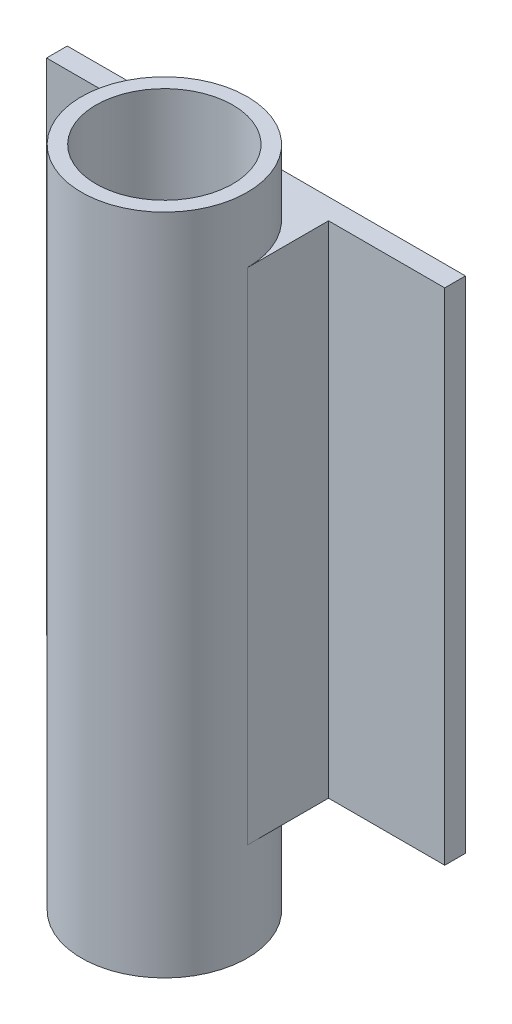
ISO-10303-21;
HEADER;
FILE_DESCRIPTION(('STEP AP214'),'2;1');
FILE_NAME('part.step','',(''),(''),'','','');
FILE_SCHEMA(('AUTOMOTIVE_DESIGN { 1 0 10303 214 1 1 1 1 }'));
ENDSEC;
DATA;
#1=APPLICATION_CONTEXT('core data for automotive mechanical design processes');
#2=APPLICATION_PROTOCOL_DEFINITION('international standard','automotive_design',2000,#1);
#3=PRODUCT_CONTEXT('',#1,'mechanical');
#4=PRODUCT('Part','Part','',(#3));
#5=PRODUCT_RELATED_PRODUCT_CATEGORY('part','',(#4));
#6=PRODUCT_DEFINITION_FORMATION('','',#4);
#7=PRODUCT_DEFINITION_CONTEXT('part definition',#1,'design');
#8=PRODUCT_DEFINITION('design','',#6,#7);
#9=PRODUCT_DEFINITION_SHAPE('','',#8);
#10=(LENGTH_UNIT() NAMED_UNIT(*) SI_UNIT(.MILLI.,.METRE.));
#11=(NAMED_UNIT(*) PLANE_ANGLE_UNIT() SI_UNIT($,.RADIAN.));
#12=(NAMED_UNIT(*) SI_UNIT($,.STERADIAN.) SOLID_ANGLE_UNIT());
#13=UNCERTAINTY_MEASURE_WITH_UNIT(LENGTH_MEASURE(1.E-05),#10,'distance_accuracy_value','');
#14=(GEOMETRIC_REPRESENTATION_CONTEXT(3) GLOBAL_UNCERTAINTY_ASSIGNED_CONTEXT((#13)) GLOBAL_UNIT_ASSIGNED_CONTEXT((#10,
#11,#12)) REPRESENTATION_CONTEXT('',''));
#15=CARTESIAN_POINT('',(0.,0.,0.));
#16=DIRECTION('',(0.,0.,1.));
#17=DIRECTION('',(1.,0.,0.));
#18=AXIS2_PLACEMENT_3D('',#15,#16,#17);
#19=CARTESIAN_POINT('',(-20.955,3.11393374928046E-11,0.));
#20=DIRECTION('',(0.,1.,0.));
#21=DIRECTION('',(0.,0.,1.));
#22=AXIS2_PLACEMENT_3D('',#19,#20,#21);
#23=PLANE('',#22);
#24=CARTESIAN_POINT('',(0.,3.11406296372367E-11,0.));
#25=DIRECTION('',(0.,-1.,0.));
#26=DIRECTION('',(0.,0.,-1.));
#27=AXIS2_PLACEMENT_3D('',#24,#25,#26);
#28=CIRCLE('',#27,20.955);
#29=CARTESIAN_POINT('',(0.,3.11406296372367E-11,-20.955));
#30=VERTEX_POINT('',#29);
#31=EDGE_CURVE('E162',#30,#30,#28,.T.);
#32=ORIENTED_EDGE('',*,*,#31,.F.);
#33=EDGE_LOOP('',(#32));
#34=FACE_BOUND('',#33,.T.);
#35=CARTESIAN_POINT('',(0.,3.11380453483725E-11,0.));
#36=DIRECTION('',(0.,-1.,0.));
#37=DIRECTION('',(0.,0.,-1.));
#38=AXIS2_PLACEMENT_3D('',#35,#36,#37);
#39=CIRCLE('',#38,25.3999999937946);
#40=CARTESIAN_POINT('',(0.,3.11380453483725E-11,-25.3999999937946));
#41=VERTEX_POINT('',#40);
#42=EDGE_CURVE('E11',#41,#41,#39,.T.);
#43=ORIENTED_EDGE('',*,*,#42,.T.);
#44=EDGE_LOOP('',(#43));
#45=FACE_BOUND('',#44,.T.);
#46=ADVANCED_FACE('F41',(#34,#45),#23,.F.);
#47=CARTESIAN_POINT('',(0.,0.,0.));
#48=DIRECTION('',(0.,-1.,0.));
#49=DIRECTION('',(0.,0.,-1.));
#50=AXIS2_PLACEMENT_3D('',#47,#48,#49);
#51=CYLINDRICAL_SURFACE('',#50,25.3999999938142);
#52=CARTESIAN_POINT('',(0.,183.199999999963,0.));
#53=DIRECTION('',(0.,1.,0.));
#54=DIRECTION('',(0.,0.,1.));
#55=AXIS2_PLACEMENT_3D('',#52,#53,#54);
#56=CIRCLE('',#55,25.3999999937946);
#57=CARTESIAN_POINT('',(-25.3999999937946,183.199999999963,0.));
#58=VERTEX_POINT('',#57);
#59=CARTESIAN_POINT('',(25.3999999938044,183.199999999963,0.));
#60=VERTEX_POINT('',#59);
#61=EDGE_CURVE('E55',#58,#60,#56,.F.);
#62=ORIENTED_EDGE('',*,*,#61,.F.);
#63=DIRECTION('',(0.,-1.,0.));
#64=VECTOR('',#63,1.);
#65=CARTESIAN_POINT('',(-25.3999999937946,309.138725178568,0.));
#66=LINE('',#65,#64);
#67=CARTESIAN_POINT('',(-25.3999999938142,30.0000000000311,0.));
#68=VERTEX_POINT('',#67);
#69=EDGE_CURVE('E60',#58,#68,#66,.T.);
#70=ORIENTED_EDGE('',*,*,#69,.T.);
#71=CARTESIAN_POINT('',(0.,30.0000000000311,0.));
#72=DIRECTION('',(0.,-1.,0.));
#73=DIRECTION('',(0.,0.,-1.));
#74=AXIS2_PLACEMENT_3D('',#71,#72,#73);
#75=CIRCLE('',#74,25.3999999937946);
#76=CARTESIAN_POINT('',(25.3999999937946,30.0000000000311,0.));
#77=VERTEX_POINT('',#76);
#78=EDGE_CURVE('E132',#68,#77,#75,.T.);
#79=ORIENTED_EDGE('',*,*,#78,.T.);
#80=DIRECTION('',(0.,-1.,0.));
#81=VECTOR('',#80,1.);
#82=CARTESIAN_POINT('',(25.3999999937946,309.138725178568,0.));
#83=LINE('',#82,#81);
#84=EDGE_CURVE('E149',#60,#77,#83,.T.);
#85=ORIENTED_EDGE('',*,*,#84,.F.);
#86=EDGE_LOOP('',(#62,#70,#79,#85));
#87=FACE_BOUND('',#86,.T.);
#88=ORIENTED_EDGE('',*,*,#42,.F.);
#89=EDGE_LOOP('',(#88));
#90=FACE_BOUND('',#89,.T.);
#91=CARTESIAN_POINT('',(0.,203.199999999963,0.));
#92=DIRECTION('',(0.,-1.,0.));
#93=DIRECTION('',(0.,0.,-1.));
#94=AXIS2_PLACEMENT_3D('',#91,#92,#93);
#95=CIRCLE('',#94,25.3999999938337);
#96=CARTESIAN_POINT('',(0.,203.199999999963,-25.3999999938337));
#97=VERTEX_POINT('',#96);
#98=EDGE_CURVE('E48',#97,#97,#95,.T.);
#99=ORIENTED_EDGE('',*,*,#98,.T.);
#100=EDGE_LOOP('',(#99));
#101=FACE_BOUND('',#100,.T.);
#102=ADVANCED_FACE('F182',(#87,#90,#101),#51,.T.);
#103=CARTESIAN_POINT('',(-20.9550000000491,203.199999999963,0.));
#104=DIRECTION('',(0.,-1.,0.));
#105=DIRECTION('',(0.,0.,-1.));
#106=AXIS2_PLACEMENT_3D('',#103,#104,#105);
#107=PLANE('',#106);
#108=ORIENTED_EDGE('',*,*,#98,.F.);
#109=EDGE_LOOP('',(#108));
#110=FACE_BOUND('',#109,.T.);
#111=CARTESIAN_POINT('',(0.,203.199999999963,0.));
#112=DIRECTION('',(0.,-1.,0.));
#113=DIRECTION('',(0.,0.,-1.));
#114=AXIS2_PLACEMENT_3D('',#111,#112,#113);
#115=CIRCLE('',#114,20.9550000000491);
#116=CARTESIAN_POINT('',(0.,203.199999999963,-20.9550000000491));
#117=VERTEX_POINT('',#116);
#118=EDGE_CURVE('E177',#117,#117,#115,.T.);
#119=ORIENTED_EDGE('',*,*,#118,.T.);
#120=EDGE_LOOP('',(#119));
#121=FACE_BOUND('',#120,.T.);
#122=ADVANCED_FACE('F184',(#110,#121),#107,.F.);
#123=CARTESIAN_POINT('',(0.,0.,0.));
#124=DIRECTION('',(0.,-1.,0.));
#125=DIRECTION('',(0.,0.,-1.));
#126=AXIS2_PLACEMENT_3D('',#123,#124,#125);
#127=CYLINDRICAL_SURFACE('',#126,20.9550000000491);
#128=ORIENTED_EDGE('',*,*,#118,.F.);
#129=EDGE_LOOP('',(#128));
#130=FACE_BOUND('',#129,.T.);
#131=CARTESIAN_POINT('',(0.,165.099999999963,0.));
#132=DIRECTION('',(0.,-1.,0.));
#133=DIRECTION('',(0.,0.,-1.));
#134=AXIS2_PLACEMENT_3D('',#131,#132,#133);
#135=CIRCLE('',#134,20.9550000000491);
#136=CARTESIAN_POINT('',(0.,165.099999999963,-20.9550000000491));
#137=VERTEX_POINT('',#136);
#138=EDGE_CURVE('E174',#137,#137,#135,.T.);
#139=ORIENTED_EDGE('',*,*,#138,.T.);
#140=EDGE_LOOP('',(#139));
#141=FACE_BOUND('',#140,.T.);
#142=ADVANCED_FACE('F187',(#130,#141),#127,.F.);
#143=CARTESIAN_POINT('',(-19.177000000049,165.099999999963,0.));
#144=DIRECTION('',(0.,-1.,0.));
#145=DIRECTION('',(0.,0.,-1.));
#146=AXIS2_PLACEMENT_3D('',#143,#144,#145);
#147=PLANE('',#146);
#148=ORIENTED_EDGE('',*,*,#138,.F.);
#149=EDGE_LOOP('',(#148));
#150=FACE_BOUND('',#149,.T.);
#151=CARTESIAN_POINT('',(0.,165.099999999963,0.));
#152=DIRECTION('',(0.,-1.,0.));
#153=DIRECTION('',(0.,0.,-1.));
#154=AXIS2_PLACEMENT_3D('',#151,#152,#153);
#155=CIRCLE('',#154,19.177000000049);
#156=CARTESIAN_POINT('',(0.,165.099999999963,-19.177000000049));
#157=VERTEX_POINT('',#156);
#158=EDGE_CURVE('E171',#157,#157,#155,.T.);
#159=ORIENTED_EDGE('',*,*,#158,.T.);
#160=EDGE_LOOP('',(#159));
#161=FACE_BOUND('',#160,.T.);
#162=ADVANCED_FACE('F193',(#150,#161),#147,.F.);
#163=CARTESIAN_POINT('',(0.,0.,0.));
#164=DIRECTION('',(0.,-1.,0.));
#165=DIRECTION('',(0.,0.,-1.));
#166=AXIS2_PLACEMENT_3D('',#163,#164,#165);
#167=CYLINDRICAL_SURFACE('',#166,19.177000000049);
#168=ORIENTED_EDGE('',*,*,#158,.F.);
#169=EDGE_LOOP('',(#168));
#170=FACE_BOUND('',#169,.T.);
#171=CARTESIAN_POINT('',(0.,38.0999999999633,0.));
#172=DIRECTION('',(0.,-1.,0.));
#173=DIRECTION('',(0.,0.,-1.));
#174=AXIS2_PLACEMENT_3D('',#171,#172,#173);
#175=CIRCLE('',#174,19.177000000049);
#176=CARTESIAN_POINT('',(0.,38.0999999999633,-19.177000000049));
#177=VERTEX_POINT('',#176);
#178=EDGE_CURVE('E168',#177,#177,#175,.T.);
#179=ORIENTED_EDGE('',*,*,#178,.T.);
#180=EDGE_LOOP('',(#179));
#181=FACE_BOUND('',#180,.T.);
#182=ADVANCED_FACE('F199',(#170,#181),#167,.F.);
#183=CARTESIAN_POINT('',(-20.955,38.0999999999972,0.));
#184=DIRECTION('',(0.,1.,0.));
#185=DIRECTION('',(0.,0.,1.));
#186=AXIS2_PLACEMENT_3D('',#183,#184,#185);
#187=PLANE('',#186);
#188=ORIENTED_EDGE('',*,*,#178,.F.);
#189=EDGE_LOOP('',(#188));
#190=FACE_BOUND('',#189,.T.);
#191=CARTESIAN_POINT('',(0.,38.1000000000311,0.));
#192=DIRECTION('',(0.,-1.,0.));
#193=DIRECTION('',(0.,0.,-1.));
#194=AXIS2_PLACEMENT_3D('',#191,#192,#193);
#195=CIRCLE('',#194,20.955);
#196=CARTESIAN_POINT('',(0.,38.1000000000311,-20.955));
#197=VERTEX_POINT('',#196);
#198=EDGE_CURVE('E165',#197,#197,#195,.T.);
#199=ORIENTED_EDGE('',*,*,#198,.T.);
#200=EDGE_LOOP('',(#199));
#201=FACE_BOUND('',#200,.T.);
#202=ADVANCED_FACE('F205',(#190,#201),#187,.F.);
#203=CARTESIAN_POINT('',(0.,0.,0.));
#204=DIRECTION('',(0.,-1.,0.));
#205=DIRECTION('',(0.,0.,-1.));
#206=AXIS2_PLACEMENT_3D('',#203,#204,#205);
#207=CYLINDRICAL_SURFACE('',#206,20.955);
#208=ORIENTED_EDGE('',*,*,#198,.F.);
#209=EDGE_LOOP('',(#208));
#210=FACE_BOUND('',#209,.T.);
#211=ORIENTED_EDGE('',*,*,#31,.T.);
#212=EDGE_LOOP('',(#211));
#213=FACE_BOUND('',#212,.T.);
#214=ADVANCED_FACE('F211',(#210,#213),#207,.F.);
#215=CARTESIAN_POINT('',(0.,183.199999999963,0.));
#216=DIRECTION('',(0.,1.,0.));
#217=DIRECTION('',(0.,0.,1.));
#218=AXIS2_PLACEMENT_3D('',#215,#216,#217);
#219=PLANE('',#218);
#220=DIRECTION('',(0.,0.,-1.));
#221=VECTOR('',#220,1.);
#222=CARTESIAN_POINT('',(-25.3999999937946,183.199999999963,0.));
#223=LINE('',#222,#221);
#224=CARTESIAN_POINT('',(-25.3999999937946,183.199999999963,-24.8999999937946));
#225=VERTEX_POINT('',#224);
#226=EDGE_CURVE('E107',#58,#225,#223,.T.);
#227=ORIENTED_EDGE('',*,*,#226,.F.);
#228=ORIENTED_EDGE('',*,*,#61,.T.);
#229=DIRECTION('',(0.,0.,-1.));
#230=VECTOR('',#229,1.);
#231=CARTESIAN_POINT('',(25.3999999937946,183.199999999963,0.));
#232=LINE('',#231,#230);
#233=CARTESIAN_POINT('',(25.3999999937946,183.199999999963,-24.8999999937946));
#234=VERTEX_POINT('',#233);
#235=EDGE_CURVE('E135',#60,#234,#232,.T.);
#236=ORIENTED_EDGE('',*,*,#235,.T.);
#237=DIRECTION('',(1.,0.,0.));
#238=VECTOR('',#237,1.);
#239=CARTESIAN_POINT('',(0.,183.199999999963,-24.8999999937946));
#240=LINE('',#239,#238);
#241=CARTESIAN_POINT('',(61.,183.199999999963,-24.8999999937946));
#242=VERTEX_POINT('',#241);
#243=EDGE_CURVE('E137',#234,#242,#240,.T.);
#244=ORIENTED_EDGE('',*,*,#243,.T.);
#245=DIRECTION('',(0.,0.,1.));
#246=VECTOR('',#245,1.);
#247=CARTESIAN_POINT('',(61.,183.199999999963,0.));
#248=LINE('',#247,#246);
#249=CARTESIAN_POINT('',(61.,183.199999999963,-31.2499999937946));
#250=VERTEX_POINT('',#249);
#251=EDGE_CURVE('E139',#250,#242,#248,.T.);
#252=ORIENTED_EDGE('',*,*,#251,.F.);
#253=DIRECTION('',(1.,0.,0.));
#254=VECTOR('',#253,1.);
#255=CARTESIAN_POINT('',(0.,183.199999999963,-31.2499999937946));
#256=LINE('',#255,#254);
#257=CARTESIAN_POINT('',(-61.,183.199999999963,-31.2499999937946));
#258=VERTEX_POINT('',#257);
#259=EDGE_CURVE('E144',#258,#250,#256,.T.);
#260=ORIENTED_EDGE('',*,*,#259,.F.);
#261=DIRECTION('',(0.,0.,1.));
#262=VECTOR('',#261,1.);
#263=CARTESIAN_POINT('',(-61.,183.199999999963,0.));
#264=LINE('',#263,#262);
#265=CARTESIAN_POINT('',(-61.,183.199999999963,-24.8999999937946));
#266=VERTEX_POINT('',#265);
#267=EDGE_CURVE('E109',#258,#266,#264,.T.);
#268=ORIENTED_EDGE('',*,*,#267,.T.);
#269=DIRECTION('',(1.,0.,0.));
#270=VECTOR('',#269,1.);
#271=CARTESIAN_POINT('',(0.,183.199999999963,-24.8999999937946));
#272=LINE('',#271,#270);
#273=EDGE_CURVE('E103',#266,#225,#272,.T.);
#274=ORIENTED_EDGE('',*,*,#273,.T.);
#275=EDGE_LOOP('',(#227,#228,#236,#244,#252,#260,#268,#274));
#276=FACE_BOUND('',#275,.T.);
#277=ADVANCED_FACE('F105',(#276),#219,.T.);
#278=CARTESIAN_POINT('',(0.,30.0000000000311,0.));
#279=DIRECTION('',(0.,-1.,0.));
#280=DIRECTION('',(0.,0.,-1.));
#281=AXIS2_PLACEMENT_3D('',#278,#279,#280);
#282=PLANE('',#281);
#283=ORIENTED_EDGE('',*,*,#78,.F.);
#284=DIRECTION('',(0.,0.,-1.));
#285=VECTOR('',#284,1.);
#286=CARTESIAN_POINT('',(-25.3999999937946,30.0000000000311,0.));
#287=LINE('',#286,#285);
#288=CARTESIAN_POINT('',(-25.3999999937946,30.0000000000311,-24.8999999937946));
#289=VERTEX_POINT('',#288);
#290=EDGE_CURVE('E112',#68,#289,#287,.T.);
#291=ORIENTED_EDGE('',*,*,#290,.T.);
#292=DIRECTION('',(1.,0.,0.));
#293=VECTOR('',#292,1.);
#294=CARTESIAN_POINT('',(0.,30.0000000000311,-24.8999999937946));
#295=LINE('',#294,#293);
#296=CARTESIAN_POINT('',(-61.,30.0000000000311,-24.8999999937946));
#297=VERTEX_POINT('',#296);
#298=EDGE_CURVE('E118',#297,#289,#295,.T.);
#299=ORIENTED_EDGE('',*,*,#298,.F.);
#300=DIRECTION('',(0.,0.,1.));
#301=VECTOR('',#300,1.);
#302=CARTESIAN_POINT('',(-61.,30.0000000000311,0.));
#303=LINE('',#302,#301);
#304=CARTESIAN_POINT('',(-61.,30.0000000000311,-31.2499999937946));
#305=VERTEX_POINT('',#304);
#306=EDGE_CURVE('E147',#305,#297,#303,.T.);
#307=ORIENTED_EDGE('',*,*,#306,.F.);
#308=DIRECTION('',(1.,0.,0.));
#309=VECTOR('',#308,1.);
#310=CARTESIAN_POINT('',(0.,30.0000000000311,-31.2499999937946));
#311=LINE('',#310,#309);
#312=CARTESIAN_POINT('',(61.,30.0000000000311,-31.2499999937946));
#313=VERTEX_POINT('',#312);
#314=EDGE_CURVE('E128',#305,#313,#311,.T.);
#315=ORIENTED_EDGE('',*,*,#314,.T.);
#316=DIRECTION('',(0.,0.,1.));
#317=VECTOR('',#316,1.);
#318=CARTESIAN_POINT('',(61.,30.0000000000311,0.));
#319=LINE('',#318,#317);
#320=CARTESIAN_POINT('',(61.,30.0000000000311,-24.8999999937946));
#321=VERTEX_POINT('',#320);
#322=EDGE_CURVE('E125',#313,#321,#319,.T.);
#323=ORIENTED_EDGE('',*,*,#322,.T.);
#324=CARTESIAN_POINT('',(25.3999999937946,30.0000000000311,-24.8999999937946));
#325=VERTEX_POINT('',#324);
#326=EDGE_CURVE('E153',#325,#321,#295,.T.);
#327=ORIENTED_EDGE('',*,*,#326,.F.);
#328=DIRECTION('',(0.,0.,-1.));
#329=VECTOR('',#328,1.);
#330=CARTESIAN_POINT('',(25.3999999937946,30.0000000000311,0.));
#331=LINE('',#330,#329);
#332=EDGE_CURVE('E152',#77,#325,#331,.T.);
#333=ORIENTED_EDGE('',*,*,#332,.F.);
#334=EDGE_LOOP('',(#283,#291,#299,#307,#315,#323,#327,#333));
#335=FACE_BOUND('',#334,.T.);
#336=ADVANCED_FACE('F230',(#335),#282,.T.);
#337=CARTESIAN_POINT('',(-25.3999999937946,309.138725178568,0.));
#338=DIRECTION('',(-1.,0.,0.));
#339=DIRECTION('',(0.,0.,1.));
#340=AXIS2_PLACEMENT_3D('',#337,#338,#339);
#341=PLANE('',#340);
#342=ORIENTED_EDGE('',*,*,#69,.F.);
#343=ORIENTED_EDGE('',*,*,#226,.T.);
#344=DIRECTION('',(0.,-1.,0.));
#345=VECTOR('',#344,1.);
#346=CARTESIAN_POINT('',(-25.3999999937946,309.138725178568,-24.8999999937946));
#347=LINE('',#346,#345);
#348=EDGE_CURVE('E115',#225,#289,#347,.T.);
#349=ORIENTED_EDGE('',*,*,#348,.T.);
#350=ORIENTED_EDGE('',*,*,#290,.F.);
#351=EDGE_LOOP('',(#342,#343,#349,#350));
#352=FACE_BOUND('',#351,.T.);
#353=ADVANCED_FACE('F124',(#352),#341,.T.);
#354=CARTESIAN_POINT('',(0.,309.138725178568,-24.8999999937946));
#355=DIRECTION('',(0.,0.,-1.));
#356=DIRECTION('',(-1.,0.,0.));
#357=AXIS2_PLACEMENT_3D('',#354,#355,#356);
#358=PLANE('',#357);
#359=ORIENTED_EDGE('',*,*,#273,.F.);
#360=DIRECTION('',(0.,-1.,0.));
#361=VECTOR('',#360,1.);
#362=CARTESIAN_POINT('',(-61.,309.138725178568,-24.8999999937946));
#363=LINE('',#362,#361);
#364=EDGE_CURVE('E122',#266,#297,#363,.T.);
#365=ORIENTED_EDGE('',*,*,#364,.T.);
#366=ORIENTED_EDGE('',*,*,#298,.T.);
#367=ORIENTED_EDGE('',*,*,#348,.F.);
#368=EDGE_LOOP('',(#359,#365,#366,#367));
#369=FACE_BOUND('',#368,.T.);
#370=ADVANCED_FACE('F116',(#369),#358,.F.);
#371=CARTESIAN_POINT('',(-61.,309.138725178568,0.));
#372=DIRECTION('',(1.,0.,0.));
#373=DIRECTION('',(0.,0.,-1.));
#374=AXIS2_PLACEMENT_3D('',#371,#372,#373);
#375=PLANE('',#374);
#376=ORIENTED_EDGE('',*,*,#267,.F.);
#377=DIRECTION('',(0.,-1.,0.));
#378=VECTOR('',#377,1.);
#379=CARTESIAN_POINT('',(-61.,309.138725178568,-31.2499999937946));
#380=LINE('',#379,#378);
#381=EDGE_CURVE('E158',#258,#305,#380,.T.);
#382=ORIENTED_EDGE('',*,*,#381,.T.);
#383=ORIENTED_EDGE('',*,*,#306,.T.);
#384=ORIENTED_EDGE('',*,*,#364,.F.);
#385=EDGE_LOOP('',(#376,#382,#383,#384));
#386=FACE_BOUND('',#385,.T.);
#387=ADVANCED_FACE('F233',(#386),#375,.F.);
#388=CARTESIAN_POINT('',(0.,309.138725178568,-31.2499999937946));
#389=DIRECTION('',(0.,0.,-1.));
#390=DIRECTION('',(-1.,0.,0.));
#391=AXIS2_PLACEMENT_3D('',#388,#389,#390);
#392=PLANE('',#391);
#393=ORIENTED_EDGE('',*,*,#381,.F.);
#394=ORIENTED_EDGE('',*,*,#259,.T.);
#395=DIRECTION('',(0.,-1.,0.));
#396=VECTOR('',#395,1.);
#397=CARTESIAN_POINT('',(61.,309.138725178568,-31.2499999937946));
#398=LINE('',#397,#396);
#399=EDGE_CURVE('E143',#250,#313,#398,.T.);
#400=ORIENTED_EDGE('',*,*,#399,.T.);
#401=ORIENTED_EDGE('',*,*,#314,.F.);
#402=EDGE_LOOP('',(#393,#394,#400,#401));
#403=FACE_BOUND('',#402,.T.);
#404=ADVANCED_FACE('F236',(#403),#392,.T.);
#405=CARTESIAN_POINT('',(61.,309.138725178568,0.));
#406=DIRECTION('',(1.,0.,0.));
#407=DIRECTION('',(0.,0.,-1.));
#408=AXIS2_PLACEMENT_3D('',#405,#406,#407);
#409=PLANE('',#408);
#410=ORIENTED_EDGE('',*,*,#399,.F.);
#411=ORIENTED_EDGE('',*,*,#251,.T.);
#412=DIRECTION('',(0.,-1.,0.));
#413=VECTOR('',#412,1.);
#414=CARTESIAN_POINT('',(61.,309.138725178568,-24.8999999937946));
#415=LINE('',#414,#413);
#416=EDGE_CURVE('E142',#242,#321,#415,.T.);
#417=ORIENTED_EDGE('',*,*,#416,.T.);
#418=ORIENTED_EDGE('',*,*,#322,.F.);
#419=EDGE_LOOP('',(#410,#411,#417,#418));
#420=FACE_BOUND('',#419,.T.);
#421=ADVANCED_FACE('F240',(#420),#409,.T.);
#422=ORIENTED_EDGE('',*,*,#243,.F.);
#423=DIRECTION('',(0.,-1.,0.));
#424=VECTOR('',#423,1.);
#425=CARTESIAN_POINT('',(25.3999999937946,309.138725178568,-24.8999999937946));
#426=LINE('',#425,#424);
#427=EDGE_CURVE('E154',#234,#325,#426,.T.);
#428=ORIENTED_EDGE('',*,*,#427,.T.);
#429=ORIENTED_EDGE('',*,*,#326,.T.);
#430=ORIENTED_EDGE('',*,*,#416,.F.);
#431=EDGE_LOOP('',(#422,#428,#429,#430));
#432=FACE_BOUND('',#431,.T.);
#433=ADVANCED_FACE('F244',(#432),#358,.F.);
#434=CARTESIAN_POINT('',(25.3999999937946,309.138725178568,0.));
#435=DIRECTION('',(-1.,0.,0.));
#436=DIRECTION('',(0.,0.,1.));
#437=AXIS2_PLACEMENT_3D('',#434,#435,#436);
#438=PLANE('',#437);
#439=ORIENTED_EDGE('',*,*,#235,.F.);
#440=ORIENTED_EDGE('',*,*,#84,.T.);
#441=ORIENTED_EDGE('',*,*,#332,.T.);
#442=ORIENTED_EDGE('',*,*,#427,.F.);
#443=EDGE_LOOP('',(#439,#440,#441,#442));
#444=FACE_BOUND('',#443,.T.);
#445=ADVANCED_FACE('F248',(#444),#438,.F.);
#446=CLOSED_SHELL('',(#46,#102,#122,#142,#162,#182,#202,#214,#277,#336,#353,#370,#387,#404,#421,
#433,#445));
#447=MANIFOLD_SOLID_BREP('B2',#446);
#448=ADVANCED_BREP_SHAPE_REPRESENTATION('',(#18,#447),#14);
#449=SHAPE_DEFINITION_REPRESENTATION(#9,#448);
ENDSEC;
END-ISO-10303-21;
